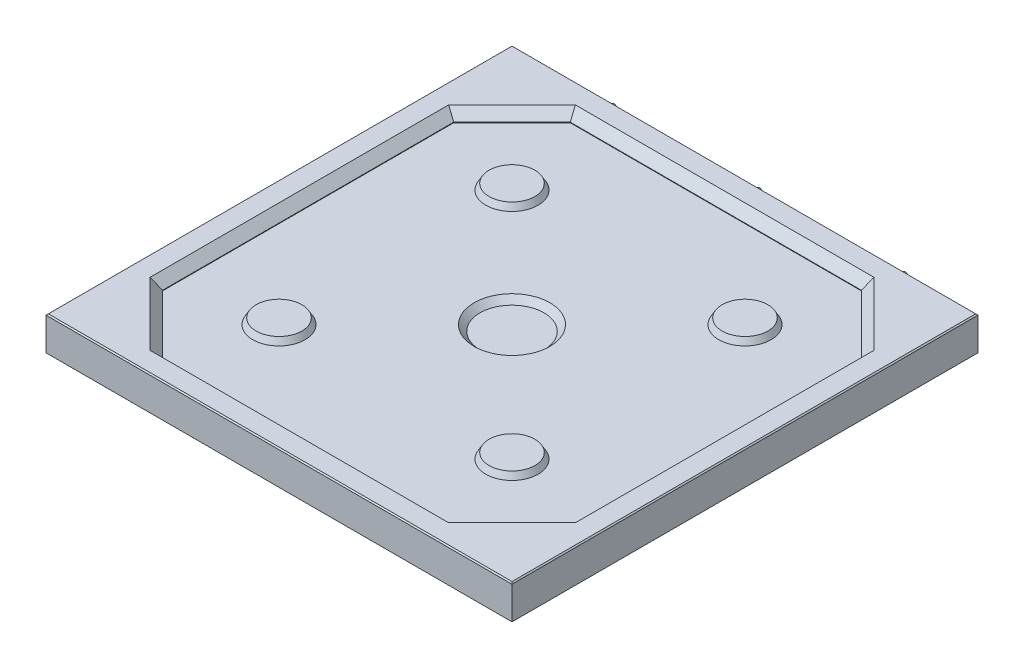
ISO-10303-21;
HEADER;
FILE_DESCRIPTION(('STEP AP214'),'2;1');
FILE_NAME('part.step','',(''),(''),'','','');
FILE_SCHEMA(('AUTOMOTIVE_DESIGN { 1 0 10303 214 1 1 1 1 }'));
ENDSEC;
DATA;
#1=APPLICATION_CONTEXT('core data for automotive mechanical design processes');
#2=APPLICATION_PROTOCOL_DEFINITION('international standard','automotive_design',2000,#1);
#3=PRODUCT_CONTEXT('',#1,'mechanical');
#4=PRODUCT('Part','Part','',(#3));
#5=PRODUCT_RELATED_PRODUCT_CATEGORY('part','',(#4));
#6=PRODUCT_DEFINITION_FORMATION('','',#4);
#7=PRODUCT_DEFINITION_CONTEXT('part definition',#1,'design');
#8=PRODUCT_DEFINITION('design','',#6,#7);
#9=PRODUCT_DEFINITION_SHAPE('','',#8);
#10=(LENGTH_UNIT() NAMED_UNIT(*) SI_UNIT(.MILLI.,.METRE.));
#11=(NAMED_UNIT(*) PLANE_ANGLE_UNIT() SI_UNIT($,.RADIAN.));
#12=(NAMED_UNIT(*) SI_UNIT($,.STERADIAN.) SOLID_ANGLE_UNIT());
#13=UNCERTAINTY_MEASURE_WITH_UNIT(LENGTH_MEASURE(1.E-05),#10,'distance_accuracy_value','');
#14=(GEOMETRIC_REPRESENTATION_CONTEXT(3) GLOBAL_UNCERTAINTY_ASSIGNED_CONTEXT((#13)) GLOBAL_UNIT_ASSIGNED_CONTEXT((#10,
#11,#12)) REPRESENTATION_CONTEXT('',''));
#15=CARTESIAN_POINT('',(0.,0.,0.));
#16=DIRECTION('',(0.,0.,1.));
#17=DIRECTION('',(1.,0.,0.));
#18=AXIS2_PLACEMENT_3D('',#15,#16,#17);
#19=CARTESIAN_POINT('',(0.,34.,0.));
#20=DIRECTION('',(0.,1.,0.));
#21=DIRECTION('',(0.,0.,1.));
#22=AXIS2_PLACEMENT_3D('',#19,#20,#21);
#23=PLANE('',#22);
#24=CARTESIAN_POINT('',(0.,33.9999999999998,0.));
#25=DIRECTION('',(0.,1.,0.));
#26=DIRECTION('',(0.,0.,1.));
#27=AXIS2_PLACEMENT_3D('',#24,#25,#26);
#28=CIRCLE('',#27,55.0000000000002);
#29=CARTESIAN_POINT('',(0.,33.9999999999998,55.0000000000002));
#30=VERTEX_POINT('',#29);
#31=EDGE_CURVE('E20',#30,#30,#28,.T.);
#32=ORIENTED_EDGE('',*,*,#31,.T.);
#33=EDGE_LOOP('',(#32));
#34=FACE_BOUND('',#33,.T.);
#35=ADVANCED_FACE('F17',(#34),#23,.T.);
#36=CARTESIAN_POINT('',(-200.,54.,200.));
#37=DIRECTION('',(0.,1.,0.));
#38=DIRECTION('',(0.,0.,1.));
#39=AXIS2_PLACEMENT_3D('',#36,#37,#38);
#40=PLANE('',#39);
#41=CARTESIAN_POINT('',(-200.,54.,200.));
#42=DIRECTION('',(0.,-1.,0.));
#43=DIRECTION('',(0.,0.,-1.));
#44=AXIS2_PLACEMENT_3D('',#41,#42,#43);
#45=CIRCLE('',#44,39.2264973081037);
#46=CARTESIAN_POINT('',(-200.,54.,160.773502691896));
#47=VERTEX_POINT('',#46);
#48=EDGE_CURVE('E230',#47,#47,#45,.T.);
#49=ORIENTED_EDGE('',*,*,#48,.F.);
#50=EDGE_LOOP('',(#49));
#51=FACE_BOUND('',#50,.T.);
#52=ADVANCED_FACE('F423',(#51),#40,.T.);
#53=CARTESIAN_POINT('',(200.,54.,200.));
#54=DIRECTION('',(0.,1.,0.));
#55=DIRECTION('',(0.,0.,1.));
#56=AXIS2_PLACEMENT_3D('',#53,#54,#55);
#57=PLANE('',#56);
#58=CARTESIAN_POINT('',(200.,54.,200.));
#59=DIRECTION('',(0.,-1.,0.));
#60=DIRECTION('',(0.,0.,-1.));
#61=AXIS2_PLACEMENT_3D('',#58,#59,#60);
#62=CIRCLE('',#61,39.2264973081037);
#63=CARTESIAN_POINT('',(200.,54.,160.773502691896));
#64=VERTEX_POINT('',#63);
#65=EDGE_CURVE('E228',#64,#64,#62,.T.);
#66=ORIENTED_EDGE('',*,*,#65,.F.);
#67=EDGE_LOOP('',(#66));
#68=FACE_BOUND('',#67,.T.);
#69=ADVANCED_FACE('F421',(#68),#57,.T.);
#70=CARTESIAN_POINT('',(200.,54.,-200.));
#71=DIRECTION('',(0.,1.,0.));
#72=DIRECTION('',(0.,0.,1.));
#73=AXIS2_PLACEMENT_3D('',#70,#71,#72);
#74=PLANE('',#73);
#75=CARTESIAN_POINT('',(200.,54.,-200.));
#76=DIRECTION('',(0.,-1.,0.));
#77=DIRECTION('',(0.,0.,-1.));
#78=AXIS2_PLACEMENT_3D('',#75,#76,#77);
#79=CIRCLE('',#78,39.2264973081037);
#80=CARTESIAN_POINT('',(200.,54.,-239.226497308104));
#81=VERTEX_POINT('',#80);
#82=EDGE_CURVE('E225',#81,#81,#79,.T.);
#83=ORIENTED_EDGE('',*,*,#82,.F.);
#84=EDGE_LOOP('',(#83));
#85=FACE_BOUND('',#84,.T.);
#86=ADVANCED_FACE('F251',(#85),#74,.T.);
#87=CARTESIAN_POINT('',(-200.,54.,-200.));
#88=DIRECTION('',(0.,1.,0.));
#89=DIRECTION('',(0.,0.,1.));
#90=AXIS2_PLACEMENT_3D('',#87,#88,#89);
#91=PLANE('',#90);
#92=CARTESIAN_POINT('',(-200.,54.,-200.));
#93=DIRECTION('',(0.,-1.,0.));
#94=DIRECTION('',(0.,0.,-1.));
#95=AXIS2_PLACEMENT_3D('',#92,#93,#94);
#96=CIRCLE('',#95,39.2264973081037);
#97=CARTESIAN_POINT('',(-200.,54.,-239.226497308104));
#98=VERTEX_POINT('',#97);
#99=EDGE_CURVE('E222',#98,#98,#96,.T.);
#100=ORIENTED_EDGE('',*,*,#99,.F.);
#101=EDGE_LOOP('',(#100));
#102=FACE_BOUND('',#101,.T.);
#103=ADVANCED_FACE('F241',(#102),#91,.T.);
#104=CARTESIAN_POINT('',(0.,44.,0.));
#105=DIRECTION('',(0.,1.,0.));
#106=DIRECTION('',(0.,0.,1.));
#107=AXIS2_PLACEMENT_3D('',#104,#105,#106);
#108=CONICAL_SURFACE('',#107,65.0000000000004,0.78539816339745);
#109=CARTESIAN_POINT('',(0.,44.,0.));
#110=DIRECTION('',(0.,1.,0.));
#111=DIRECTION('',(0.,0.,1.));
#112=AXIS2_PLACEMENT_3D('',#109,#110,#111);
#113=CIRCLE('',#112,65.0000000000004);
#114=CARTESIAN_POINT('',(0.,44.,65.0000000000004));
#115=VERTEX_POINT('',#114);
#116=EDGE_CURVE('E219',#115,#115,#113,.T.);
#117=ORIENTED_EDGE('',*,*,#116,.T.);
#118=EDGE_LOOP('',(#117));
#119=FACE_BOUND('',#118,.T.);
#120=ORIENTED_EDGE('',*,*,#31,.F.);
#121=EDGE_LOOP('',(#120));
#122=FACE_BOUND('',#121,.T.);
#123=ADVANCED_FACE('F238',(#119,#122),#108,.F.);
#124=CARTESIAN_POINT('',(-200.,44.,200.));
#125=DIRECTION('',(0.,-1.,0.));
#126=DIRECTION('',(0.,0.,-1.));
#127=AXIS2_PLACEMENT_3D('',#124,#125,#126);
#128=CONICAL_SURFACE('',#127,45.,0.523598775598298);
#129=ORIENTED_EDGE('',*,*,#48,.T.);
#130=EDGE_LOOP('',(#129));
#131=FACE_BOUND('',#130,.T.);
#132=CARTESIAN_POINT('',(-200.,44.,200.));
#133=DIRECTION('',(0.,-1.,0.));
#134=DIRECTION('',(0.,0.,-1.));
#135=AXIS2_PLACEMENT_3D('',#132,#133,#134);
#136=CIRCLE('',#135,45.);
#137=CARTESIAN_POINT('',(-200.,44.,155.));
#138=VERTEX_POINT('',#137);
#139=EDGE_CURVE('E216',#138,#138,#136,.F.);
#140=ORIENTED_EDGE('',*,*,#139,.T.);
#141=EDGE_LOOP('',(#140));
#142=FACE_BOUND('',#141,.T.);
#143=ADVANCED_FACE('F240',(#131,#142),#128,.T.);
#144=CARTESIAN_POINT('',(200.,44.,200.));
#145=DIRECTION('',(0.,-1.,0.));
#146=DIRECTION('',(0.,0.,-1.));
#147=AXIS2_PLACEMENT_3D('',#144,#145,#146);
#148=CONICAL_SURFACE('',#147,45.,0.5235987755983);
#149=ORIENTED_EDGE('',*,*,#65,.T.);
#150=EDGE_LOOP('',(#149));
#151=FACE_BOUND('',#150,.T.);
#152=CARTESIAN_POINT('',(200.,44.,200.));
#153=DIRECTION('',(0.,-1.,0.));
#154=DIRECTION('',(0.,0.,-1.));
#155=AXIS2_PLACEMENT_3D('',#152,#153,#154);
#156=CIRCLE('',#155,45.);
#157=CARTESIAN_POINT('',(200.,44.,155.));
#158=VERTEX_POINT('',#157);
#159=EDGE_CURVE('E213',#158,#158,#156,.F.);
#160=ORIENTED_EDGE('',*,*,#159,.T.);
#161=EDGE_LOOP('',(#160));
#162=FACE_BOUND('',#161,.T.);
#163=ADVANCED_FACE('F249',(#151,#162),#148,.T.);
#164=CARTESIAN_POINT('',(200.,44.,-200.));
#165=DIRECTION('',(0.,-1.,0.));
#166=DIRECTION('',(0.,0.,-1.));
#167=AXIS2_PLACEMENT_3D('',#164,#165,#166);
#168=CONICAL_SURFACE('',#167,45.,0.5235987755983);
#169=ORIENTED_EDGE('',*,*,#82,.T.);
#170=EDGE_LOOP('',(#169));
#171=FACE_BOUND('',#170,.T.);
#172=CARTESIAN_POINT('',(200.,44.,-200.));
#173=DIRECTION('',(0.,-1.,0.));
#174=DIRECTION('',(0.,0.,-1.));
#175=AXIS2_PLACEMENT_3D('',#172,#173,#174);
#176=CIRCLE('',#175,45.);
#177=CARTESIAN_POINT('',(200.,44.,-245.));
#178=VERTEX_POINT('',#177);
#179=EDGE_CURVE('E210',#178,#178,#176,.F.);
#180=ORIENTED_EDGE('',*,*,#179,.T.);
#181=EDGE_LOOP('',(#180));
#182=FACE_BOUND('',#181,.T.);
#183=ADVANCED_FACE('F402',(#171,#182),#168,.T.);
#184=CARTESIAN_POINT('',(-200.,44.,-200.));
#185=DIRECTION('',(0.,-1.,0.));
#186=DIRECTION('',(0.,0.,-1.));
#187=AXIS2_PLACEMENT_3D('',#184,#185,#186);
#188=CONICAL_SURFACE('',#187,45.,0.523598775598298);
#189=ORIENTED_EDGE('',*,*,#99,.T.);
#190=EDGE_LOOP('',(#189));
#191=FACE_BOUND('',#190,.T.);
#192=CARTESIAN_POINT('',(-200.,44.,-200.));
#193=DIRECTION('',(0.,-1.,0.));
#194=DIRECTION('',(0.,0.,-1.));
#195=AXIS2_PLACEMENT_3D('',#192,#193,#194);
#196=CIRCLE('',#195,45.);
#197=CARTESIAN_POINT('',(-200.,44.,-245.));
#198=VERTEX_POINT('',#197);
#199=EDGE_CURVE('E163',#198,#198,#196,.F.);
#200=ORIENTED_EDGE('',*,*,#199,.T.);
#201=EDGE_LOOP('',(#200));
#202=FACE_BOUND('',#201,.T.);
#203=ADVANCED_FACE('F399',(#191,#202),#188,.T.);
#204=CARTESIAN_POINT('',(-2.4980018054066E-13,44.,-600.));
#205=DIRECTION('',(0.,-1.,0.));
#206=DIRECTION('',(0.,0.,-1.));
#207=AXIS2_PLACEMENT_3D('',#204,#205,#206);
#208=PLANE('',#207);
#209=DIRECTION('',(0.,0.,1.));
#210=VECTOR('',#209,1.);
#211=CARTESIAN_POINT('',(-350.,44.,-250.));
#212=LINE('',#211,#210);
#213=CARTESIAN_POINT('',(-350.,44.,-250.));
#214=VERTEX_POINT('',#213);
#215=CARTESIAN_POINT('',(-350.,44.,250.));
#216=VERTEX_POINT('',#215);
#217=EDGE_CURVE('E675',#214,#216,#212,.T.);
#218=ORIENTED_EDGE('',*,*,#217,.T.);
#219=DIRECTION('',(0.707106781186548,0.,0.707106781186548));
#220=VECTOR('',#219,1.);
#221=CARTESIAN_POINT('',(-350.,44.,250.));
#222=LINE('',#221,#220);
#223=CARTESIAN_POINT('',(-250.,44.,350.));
#224=VERTEX_POINT('',#223);
#225=EDGE_CURVE('E676',#216,#224,#222,.T.);
#226=ORIENTED_EDGE('',*,*,#225,.T.);
#227=DIRECTION('',(1.,0.,0.));
#228=VECTOR('',#227,1.);
#229=CARTESIAN_POINT('',(-250.,44.,350.));
#230=LINE('',#229,#228);
#231=CARTESIAN_POINT('',(250.,44.,350.));
#232=VERTEX_POINT('',#231);
#233=EDGE_CURVE('E711',#224,#232,#230,.T.);
#234=ORIENTED_EDGE('',*,*,#233,.T.);
#235=DIRECTION('',(0.707106781186547,0.,-0.707106781186548));
#236=VECTOR('',#235,1.);
#237=CARTESIAN_POINT('',(250.,44.,350.));
#238=LINE('',#237,#236);
#239=CARTESIAN_POINT('',(350.,44.,250.));
#240=VERTEX_POINT('',#239);
#241=EDGE_CURVE('E706',#232,#240,#238,.T.);
#242=ORIENTED_EDGE('',*,*,#241,.T.);
#243=DIRECTION('',(0.,0.,-1.));
#244=VECTOR('',#243,1.);
#245=CARTESIAN_POINT('',(350.,44.,-250.));
#246=LINE('',#245,#244);
#247=CARTESIAN_POINT('',(350.,44.,-250.));
#248=VERTEX_POINT('',#247);
#249=EDGE_CURVE('E160',#240,#248,#246,.T.);
#250=ORIENTED_EDGE('',*,*,#249,.T.);
#251=DIRECTION('',(-0.707106781186548,0.,-0.707106781186547));
#252=VECTOR('',#251,1.);
#253=CARTESIAN_POINT('',(250.,44.,-350.));
#254=LINE('',#253,#252);
#255=CARTESIAN_POINT('',(250.,44.,-350.));
#256=VERTEX_POINT('',#255);
#257=EDGE_CURVE('E155',#248,#256,#254,.T.);
#258=ORIENTED_EDGE('',*,*,#257,.T.);
#259=DIRECTION('',(-1.,0.,0.));
#260=VECTOR('',#259,1.);
#261=CARTESIAN_POINT('',(-250.,44.,-350.));
#262=LINE('',#261,#260);
#263=CARTESIAN_POINT('',(-250.,44.,-350.));
#264=VERTEX_POINT('',#263);
#265=EDGE_CURVE('E152',#256,#264,#262,.T.);
#266=ORIENTED_EDGE('',*,*,#265,.T.);
#267=DIRECTION('',(-0.707106781186548,0.,0.707106781186548));
#268=VECTOR('',#267,1.);
#269=CARTESIAN_POINT('',(-350.,44.,-250.));
#270=LINE('',#269,#268);
#271=EDGE_CURVE('E173',#264,#214,#270,.T.);
#272=ORIENTED_EDGE('',*,*,#271,.T.);
#273=EDGE_LOOP('',(#218,#226,#234,#242,#250,#258,#266,#272));
#274=FACE_BOUND('',#273,.T.);
#275=ORIENTED_EDGE('',*,*,#199,.F.);
#276=EDGE_LOOP('',(#275));
#277=FACE_BOUND('',#276,.T.);
#278=ORIENTED_EDGE('',*,*,#179,.F.);
#279=EDGE_LOOP('',(#278));
#280=FACE_BOUND('',#279,.T.);
#281=ORIENTED_EDGE('',*,*,#159,.F.);
#282=EDGE_LOOP('',(#281));
#283=FACE_BOUND('',#282,.T.);
#284=ORIENTED_EDGE('',*,*,#139,.F.);
#285=EDGE_LOOP('',(#284));
#286=FACE_BOUND('',#285,.T.);
#287=ORIENTED_EDGE('',*,*,#116,.F.);
#288=EDGE_LOOP('',(#287));
#289=FACE_BOUND('',#288,.T.);
#290=ADVANCED_FACE('F157',(#274,#277,#280,#283,#286,#289),#208,.F.);
#291=CARTESIAN_POINT('',(250.,44.,-350.));
#292=DIRECTION('',(0.707106781186547,0.,-0.707106781186548));
#293=DIRECTION('',(-0.707106781186548,0.,-0.707106781186547));
#294=AXIS2_PLACEMENT_3D('',#291,#292,#293);
#295=PLANE('',#294);
#296=DIRECTION('',(-0.707106781186547,0.,-0.707106781186548));
#297=VECTOR('',#296,1.);
#298=CARTESIAN_POINT('',(350.,45.,-250.));
#299=LINE('',#298,#297);
#300=CARTESIAN_POINT('',(350.,45.,-250.));
#301=VERTEX_POINT('',#300);
#302=CARTESIAN_POINT('',(250.,45.,-350.));
#303=VERTEX_POINT('',#302);
#304=EDGE_CURVE('E169',#301,#303,#299,.T.);
#305=ORIENTED_EDGE('',*,*,#304,.T.);
#306=DIRECTION('',(0.,1.,0.));
#307=VECTOR('',#306,1.);
#308=CARTESIAN_POINT('',(250.,44.,-350.));
#309=LINE('',#308,#307);
#310=EDGE_CURVE('E166',#303,#256,#309,.F.);
#311=ORIENTED_EDGE('',*,*,#310,.T.);
#312=ORIENTED_EDGE('',*,*,#257,.F.);
#313=DIRECTION('',(0.,1.,0.));
#314=VECTOR('',#313,1.);
#315=CARTESIAN_POINT('',(350.,44.,-250.));
#316=LINE('',#315,#314);
#317=EDGE_CURVE('E700',#248,#301,#316,.T.);
#318=ORIENTED_EDGE('',*,*,#317,.T.);
#319=EDGE_LOOP('',(#305,#311,#312,#318));
#320=FACE_BOUND('',#319,.T.);
#321=ADVANCED_FACE('F167',(#320),#295,.F.);
#322=CARTESIAN_POINT('',(-250.,44.,-350.));
#323=DIRECTION('',(0.,0.,-1.));
#324=DIRECTION('',(-1.,0.,0.));
#325=AXIS2_PLACEMENT_3D('',#322,#323,#324);
#326=PLANE('',#325);
#327=DIRECTION('',(1.,0.,0.));
#328=VECTOR('',#327,1.);
#329=CARTESIAN_POINT('',(-250.,45.,-350.));
#330=LINE('',#329,#328);
#331=CARTESIAN_POINT('',(-250.,45.,-350.));
#332=VERTEX_POINT('',#331);
#333=EDGE_CURVE('E669',#303,#332,#330,.F.);
#334=ORIENTED_EDGE('',*,*,#333,.T.);
#335=DIRECTION('',(0.,1.,0.));
#336=VECTOR('',#335,1.);
#337=CARTESIAN_POINT('',(-250.,44.,-350.));
#338=LINE('',#337,#336);
#339=EDGE_CURVE('E177',#332,#264,#338,.F.);
#340=ORIENTED_EDGE('',*,*,#339,.T.);
#341=ORIENTED_EDGE('',*,*,#265,.F.);
#342=ORIENTED_EDGE('',*,*,#310,.F.);
#343=EDGE_LOOP('',(#334,#340,#341,#342));
#344=FACE_BOUND('',#343,.T.);
#345=ADVANCED_FACE('F175',(#344),#326,.F.);
#346=CARTESIAN_POINT('',(-350.,44.,-250.));
#347=DIRECTION('',(-0.707106781186548,0.,-0.707106781186548));
#348=DIRECTION('',(-0.707106781186548,0.,0.707106781186548));
#349=AXIS2_PLACEMENT_3D('',#346,#347,#348);
#350=PLANE('',#349);
#351=DIRECTION('',(-0.707106781186548,0.,0.707106781186547));
#352=VECTOR('',#351,1.);
#353=CARTESIAN_POINT('',(-250.,45.,-350.));
#354=LINE('',#353,#352);
#355=CARTESIAN_POINT('',(-350.,45.,-250.));
#356=VERTEX_POINT('',#355);
#357=EDGE_CURVE('E661',#332,#356,#354,.T.);
#358=ORIENTED_EDGE('',*,*,#357,.T.);
#359=DIRECTION('',(0.,1.,0.));
#360=VECTOR('',#359,1.);
#361=CARTESIAN_POINT('',(-350.,44.,-250.));
#362=LINE('',#361,#360);
#363=EDGE_CURVE('E663',#356,#214,#362,.F.);
#364=ORIENTED_EDGE('',*,*,#363,.T.);
#365=ORIENTED_EDGE('',*,*,#271,.F.);
#366=ORIENTED_EDGE('',*,*,#339,.F.);
#367=EDGE_LOOP('',(#358,#364,#365,#366));
#368=FACE_BOUND('',#367,.T.);
#369=ADVANCED_FACE('F388',(#368),#350,.F.);
#370=CARTESIAN_POINT('',(-350.,44.,-250.));
#371=DIRECTION('',(-1.,0.,0.));
#372=DIRECTION('',(0.,0.,1.));
#373=AXIS2_PLACEMENT_3D('',#370,#371,#372);
#374=PLANE('',#373);
#375=DIRECTION('',(0.,0.,1.));
#376=VECTOR('',#375,1.);
#377=CARTESIAN_POINT('',(-350.,45.,-250.));
#378=LINE('',#377,#376);
#379=CARTESIAN_POINT('',(-350.,45.,250.));
#380=VERTEX_POINT('',#379);
#381=EDGE_CURVE('E673',#356,#380,#378,.T.);
#382=ORIENTED_EDGE('',*,*,#381,.T.);
#383=DIRECTION('',(0.,1.,0.));
#384=VECTOR('',#383,1.);
#385=CARTESIAN_POINT('',(-350.,44.,250.));
#386=LINE('',#385,#384);
#387=EDGE_CURVE('E713',#380,#216,#386,.F.);
#388=ORIENTED_EDGE('',*,*,#387,.T.);
#389=ORIENTED_EDGE('',*,*,#217,.F.);
#390=ORIENTED_EDGE('',*,*,#363,.F.);
#391=EDGE_LOOP('',(#382,#388,#389,#390));
#392=FACE_BOUND('',#391,.T.);
#393=ADVANCED_FACE('F384',(#392),#374,.F.);
#394=CARTESIAN_POINT('',(-350.,44.,250.));
#395=DIRECTION('',(-0.707106781186548,0.,0.707106781186548));
#396=DIRECTION('',(0.707106781186548,0.,0.707106781186548));
#397=AXIS2_PLACEMENT_3D('',#394,#395,#396);
#398=PLANE('',#397);
#399=DIRECTION('',(0.707106781186547,0.,0.707106781186547));
#400=VECTOR('',#399,1.);
#401=CARTESIAN_POINT('',(-350.,45.,250.));
#402=LINE('',#401,#400);
#403=CARTESIAN_POINT('',(-250.,45.,350.));
#404=VERTEX_POINT('',#403);
#405=EDGE_CURVE('E683',#380,#404,#402,.T.);
#406=ORIENTED_EDGE('',*,*,#405,.T.);
#407=DIRECTION('',(0.,1.,0.));
#408=VECTOR('',#407,1.);
#409=CARTESIAN_POINT('',(-250.,44.,350.));
#410=LINE('',#409,#408);
#411=EDGE_CURVE('E708',#404,#224,#410,.F.);
#412=ORIENTED_EDGE('',*,*,#411,.T.);
#413=ORIENTED_EDGE('',*,*,#225,.F.);
#414=ORIENTED_EDGE('',*,*,#387,.F.);
#415=EDGE_LOOP('',(#406,#412,#413,#414));
#416=FACE_BOUND('',#415,.T.);
#417=ADVANCED_FACE('F380',(#416),#398,.F.);
#418=CARTESIAN_POINT('',(-250.,44.,350.));
#419=DIRECTION('',(0.,0.,1.));
#420=DIRECTION('',(1.,0.,0.));
#421=AXIS2_PLACEMENT_3D('',#418,#419,#420);
#422=PLANE('',#421);
#423=DIRECTION('',(1.,0.,0.));
#424=VECTOR('',#423,1.);
#425=CARTESIAN_POINT('',(-250.,45.,350.));
#426=LINE('',#425,#424);
#427=CARTESIAN_POINT('',(250.,45.,350.));
#428=VERTEX_POINT('',#427);
#429=EDGE_CURVE('E753',#404,#428,#426,.T.);
#430=ORIENTED_EDGE('',*,*,#429,.T.);
#431=DIRECTION('',(0.,1.,0.));
#432=VECTOR('',#431,1.);
#433=CARTESIAN_POINT('',(250.,44.,350.));
#434=LINE('',#433,#432);
#435=EDGE_CURVE('E703',#428,#232,#434,.F.);
#436=ORIENTED_EDGE('',*,*,#435,.T.);
#437=ORIENTED_EDGE('',*,*,#233,.F.);
#438=ORIENTED_EDGE('',*,*,#411,.F.);
#439=EDGE_LOOP('',(#430,#436,#437,#438));
#440=FACE_BOUND('',#439,.T.);
#441=ADVANCED_FACE('F376',(#440),#422,.F.);
#442=CARTESIAN_POINT('',(250.,44.,350.));
#443=DIRECTION('',(0.707106781186548,0.,0.707106781186547));
#444=DIRECTION('',(0.707106781186547,0.,-0.707106781186548));
#445=AXIS2_PLACEMENT_3D('',#442,#443,#444);
#446=PLANE('',#445);
#447=DIRECTION('',(0.707106781186547,0.,-0.707106781186548));
#448=VECTOR('',#447,1.);
#449=CARTESIAN_POINT('',(250.,45.,350.));
#450=LINE('',#449,#448);
#451=CARTESIAN_POINT('',(350.,45.,250.));
#452=VERTEX_POINT('',#451);
#453=EDGE_CURVE('E725',#428,#452,#450,.T.);
#454=ORIENTED_EDGE('',*,*,#453,.T.);
#455=DIRECTION('',(0.,1.,0.));
#456=VECTOR('',#455,1.);
#457=CARTESIAN_POINT('',(350.,44.,250.));
#458=LINE('',#457,#456);
#459=EDGE_CURVE('E697',#452,#240,#458,.F.);
#460=ORIENTED_EDGE('',*,*,#459,.T.);
#461=ORIENTED_EDGE('',*,*,#241,.F.);
#462=ORIENTED_EDGE('',*,*,#435,.F.);
#463=EDGE_LOOP('',(#454,#460,#461,#462));
#464=FACE_BOUND('',#463,.T.);
#465=ADVANCED_FACE('F372',(#464),#446,.F.);
#466=CARTESIAN_POINT('',(350.,44.,-250.));
#467=DIRECTION('',(1.,0.,0.));
#468=DIRECTION('',(0.,0.,-1.));
#469=AXIS2_PLACEMENT_3D('',#466,#467,#468);
#470=PLANE('',#469);
#471=DIRECTION('',(0.,0.,1.));
#472=VECTOR('',#471,1.);
#473=CARTESIAN_POINT('',(350.,45.,-250.));
#474=LINE('',#473,#472);
#475=EDGE_CURVE('E729',#452,#301,#474,.F.);
#476=ORIENTED_EDGE('',*,*,#475,.T.);
#477=ORIENTED_EDGE('',*,*,#317,.F.);
#478=ORIENTED_EDGE('',*,*,#249,.F.);
#479=ORIENTED_EDGE('',*,*,#459,.F.);
#480=EDGE_LOOP('',(#476,#477,#478,#479));
#481=FACE_BOUND('',#480,.T.);
#482=ADVANCED_FACE('F368',(#481),#470,.F.);
#483=CARTESIAN_POINT('',(250.,45.,-350.));
#484=DIRECTION('',(0.499999999999998,-0.707106781186551,-0.499999999999998));
#485=DIRECTION('',(0.,0.577350269189622,-0.816496580927728));
#486=AXIS2_PLACEMENT_3D('',#483,#484,#485);
#487=PLANE('',#486);
#488=ORIENTED_EDGE('',*,*,#304,.F.);
#489=DIRECTION('',(0.678598344545849,0.678598344545844,-0.281084637714822));
#490=VECTOR('',#489,1.);
#491=CARTESIAN_POINT('',(350.,45.,-250.));
#492=LINE('',#491,#490);
#493=CARTESIAN_POINT('',(365.,60.,-256.213203435596));
#494=VERTEX_POINT('',#493);
#495=EDGE_CURVE('E732',#301,#494,#492,.T.);
#496=ORIENTED_EDGE('',*,*,#495,.T.);
#497=DIRECTION('',(-0.707106781186547,0.,-0.707106781186548));
#498=VECTOR('',#497,1.);
#499=CARTESIAN_POINT('',(365.,60.,-256.213203435596));
#500=LINE('',#499,#498);
#501=CARTESIAN_POINT('',(256.213203435596,60.,-365.));
#502=VERTEX_POINT('',#501);
#503=EDGE_CURVE('E740',#494,#502,#500,.T.);
#504=ORIENTED_EDGE('',*,*,#503,.T.);
#505=DIRECTION('',(-0.281084637714822,-0.678598344545844,0.678598344545849));
#506=VECTOR('',#505,1.);
#507=CARTESIAN_POINT('',(256.213203435596,60.,-365.));
#508=LINE('',#507,#506);
#509=EDGE_CURVE('E694',#502,#303,#508,.T.);
#510=ORIENTED_EDGE('',*,*,#509,.T.);
#511=EDGE_LOOP('',(#488,#496,#504,#510));
#512=FACE_BOUND('',#511,.T.);
#513=ADVANCED_FACE('F364',(#512),#487,.F.);
#514=CARTESIAN_POINT('',(-250.,45.,-350.));
#515=DIRECTION('',(0.,-0.70710678118655,-0.707106781186545));
#516=DIRECTION('',(0.,0.707106781186545,-0.70710678118655));
#517=AXIS2_PLACEMENT_3D('',#514,#515,#516);
#518=PLANE('',#517);
#519=ORIENTED_EDGE('',*,*,#333,.F.);
#520=ORIENTED_EDGE('',*,*,#509,.F.);
#521=DIRECTION('',(1.,0.,0.));
#522=VECTOR('',#521,1.);
#523=CARTESIAN_POINT('',(-400.,60.,-365.));
#524=LINE('',#523,#522);
#525=CARTESIAN_POINT('',(-256.213203435597,60.,-365.));
#526=VERTEX_POINT('',#525);
#527=EDGE_CURVE('E742',#502,#526,#524,.F.);
#528=ORIENTED_EDGE('',*,*,#527,.T.);
#529=DIRECTION('',(0.281084637714827,-0.678598344545843,0.678598344545848));
#530=VECTOR('',#529,1.);
#531=CARTESIAN_POINT('',(-256.213203435597,60.,-365.));
#532=LINE('',#531,#530);
#533=EDGE_CURVE('E668',#526,#332,#532,.T.);
#534=ORIENTED_EDGE('',*,*,#533,.T.);
#535=EDGE_LOOP('',(#519,#520,#528,#534));
#536=FACE_BOUND('',#535,.T.);
#537=ADVANCED_FACE('F360',(#536),#518,.F.);
#538=CARTESIAN_POINT('',(-350.,45.,-250.));
#539=DIRECTION('',(-0.499999999999997,-0.707106781186552,-0.499999999999997));
#540=DIRECTION('',(0.,0.577350269189621,-0.816496580927729));
#541=AXIS2_PLACEMENT_3D('',#538,#539,#540);
#542=PLANE('',#541);
#543=DIRECTION('',(-0.707106781186548,0.,0.707106781186548));
#544=VECTOR('',#543,1.);
#545=CARTESIAN_POINT('',(-256.213203435597,60.,-365.));
#546=LINE('',#545,#544);
#547=CARTESIAN_POINT('',(-365.,60.,-256.213203435597));
#548=VERTEX_POINT('',#547);
#549=EDGE_CURVE('E681',#526,#548,#546,.T.);
#550=ORIENTED_EDGE('',*,*,#549,.T.);
#551=DIRECTION('',(0.678598344545847,-0.678598344545844,0.281084637714828));
#552=VECTOR('',#551,1.);
#553=CARTESIAN_POINT('',(-365.,60.,-256.213203435597));
#554=LINE('',#553,#552);
#555=EDGE_CURVE('E679',#548,#356,#554,.T.);
#556=ORIENTED_EDGE('',*,*,#555,.T.);
#557=ORIENTED_EDGE('',*,*,#357,.F.);
#558=ORIENTED_EDGE('',*,*,#533,.F.);
#559=EDGE_LOOP('',(#550,#556,#557,#558));
#560=FACE_BOUND('',#559,.T.);
#561=ADVANCED_FACE('F356',(#560),#542,.F.);
#562=CARTESIAN_POINT('',(-350.,45.,-250.));
#563=DIRECTION('',(-0.707106781186545,-0.70710678118655,0.));
#564=DIRECTION('',(0.70710678118655,-0.707106781186545,0.));
#565=AXIS2_PLACEMENT_3D('',#562,#563,#564);
#566=PLANE('',#565);
#567=DIRECTION('',(0.,0.,-1.));
#568=VECTOR('',#567,1.);
#569=CARTESIAN_POINT('',(-365.,60.,-400.));
#570=LINE('',#569,#568);
#571=CARTESIAN_POINT('',(-365.,60.,256.213203435596));
#572=VERTEX_POINT('',#571);
#573=EDGE_CURVE('E774',#548,#572,#570,.F.);
#574=ORIENTED_EDGE('',*,*,#573,.T.);
#575=DIRECTION('',(0.678598344545848,-0.678598344545845,-0.281084637714823));
#576=VECTOR('',#575,1.);
#577=CARTESIAN_POINT('',(-365.,60.,256.213203435596));
#578=LINE('',#577,#576);
#579=EDGE_CURVE('E687',#572,#380,#578,.T.);
#580=ORIENTED_EDGE('',*,*,#579,.T.);
#581=ORIENTED_EDGE('',*,*,#381,.F.);
#582=ORIENTED_EDGE('',*,*,#555,.F.);
#583=EDGE_LOOP('',(#574,#580,#581,#582));
#584=FACE_BOUND('',#583,.T.);
#585=ADVANCED_FACE('F352',(#584),#566,.F.);
#586=CARTESIAN_POINT('',(-350.,45.,250.));
#587=DIRECTION('',(-0.499999999999998,-0.707106781186551,0.499999999999998));
#588=DIRECTION('',(0.,-0.577350269189622,-0.816496580927728));
#589=AXIS2_PLACEMENT_3D('',#586,#587,#588);
#590=PLANE('',#589);
#591=DIRECTION('',(0.707106781186547,0.,0.707106781186547));
#592=VECTOR('',#591,1.);
#593=CARTESIAN_POINT('',(-365.,60.,256.213203435596));
#594=LINE('',#593,#592);
#595=CARTESIAN_POINT('',(-256.213203435597,60.,365.));
#596=VERTEX_POINT('',#595);
#597=EDGE_CURVE('E772',#572,#596,#594,.T.);
#598=ORIENTED_EDGE('',*,*,#597,.T.);
#599=DIRECTION('',(0.281084637714825,-0.678598344545844,-0.678598344545848));
#600=VECTOR('',#599,1.);
#601=CARTESIAN_POINT('',(-256.213203435597,60.,365.));
#602=LINE('',#601,#600);
#603=EDGE_CURVE('E751',#596,#404,#602,.T.);
#604=ORIENTED_EDGE('',*,*,#603,.T.);
#605=ORIENTED_EDGE('',*,*,#405,.F.);
#606=ORIENTED_EDGE('',*,*,#579,.F.);
#607=EDGE_LOOP('',(#598,#604,#605,#606));
#608=FACE_BOUND('',#607,.T.);
#609=ADVANCED_FACE('F348',(#608),#590,.F.);
#610=CARTESIAN_POINT('',(-250.,45.,350.));
#611=DIRECTION('',(0.,-0.707106781186549,0.707106781186546));
#612=DIRECTION('',(0.,-0.707106781186546,-0.707106781186549));
#613=AXIS2_PLACEMENT_3D('',#610,#611,#612);
#614=PLANE('',#613);
#615=DIRECTION('',(1.,0.,0.));
#616=VECTOR('',#615,1.);
#617=CARTESIAN_POINT('',(-400.,60.,365.));
#618=LINE('',#617,#616);
#619=CARTESIAN_POINT('',(256.213203435597,60.,365.));
#620=VERTEX_POINT('',#619);
#621=EDGE_CURVE('E759',#596,#620,#618,.T.);
#622=ORIENTED_EDGE('',*,*,#621,.T.);
#623=DIRECTION('',(-0.281084637714836,-0.678598344545843,-0.678598344545844));
#624=VECTOR('',#623,1.);
#625=CARTESIAN_POINT('',(256.213203435597,60.,365.));
#626=LINE('',#625,#624);
#627=EDGE_CURVE('E747',#620,#428,#626,.T.);
#628=ORIENTED_EDGE('',*,*,#627,.T.);
#629=ORIENTED_EDGE('',*,*,#429,.F.);
#630=ORIENTED_EDGE('',*,*,#603,.F.);
#631=EDGE_LOOP('',(#622,#628,#629,#630));
#632=FACE_BOUND('',#631,.T.);
#633=ADVANCED_FACE('F344',(#632),#614,.F.);
#634=CARTESIAN_POINT('',(250.,45.,350.));
#635=DIRECTION('',(0.499999999999995,-0.707106781186555,0.499999999999995));
#636=DIRECTION('',(0.816496580927731,0.577350269189618,0.));
#637=AXIS2_PLACEMENT_3D('',#634,#635,#636);
#638=PLANE('',#637);
#639=DIRECTION('',(0.707106781186547,0.,-0.707106781186548));
#640=VECTOR('',#639,1.);
#641=CARTESIAN_POINT('',(256.213203435597,60.,365.));
#642=LINE('',#641,#640);
#643=CARTESIAN_POINT('',(365.,60.,256.213203435597));
#644=VERTEX_POINT('',#643);
#645=EDGE_CURVE('E761',#620,#644,#642,.T.);
#646=ORIENTED_EDGE('',*,*,#645,.T.);
#647=DIRECTION('',(-0.678598344545847,-0.678598344545842,-0.281084637714832));
#648=VECTOR('',#647,1.);
#649=CARTESIAN_POINT('',(365.,60.,256.213203435597));
#650=LINE('',#649,#648);
#651=EDGE_CURVE('E733',#644,#452,#650,.T.);
#652=ORIENTED_EDGE('',*,*,#651,.T.);
#653=ORIENTED_EDGE('',*,*,#453,.F.);
#654=ORIENTED_EDGE('',*,*,#627,.F.);
#655=EDGE_LOOP('',(#646,#652,#653,#654));
#656=FACE_BOUND('',#655,.T.);
#657=ADVANCED_FACE('F340',(#656),#638,.F.);
#658=CARTESIAN_POINT('',(350.,45.,-250.));
#659=DIRECTION('',(0.707106781186545,-0.70710678118655,0.));
#660=DIRECTION('',(0.70710678118655,0.707106781186545,0.));
#661=AXIS2_PLACEMENT_3D('',#658,#659,#660);
#662=PLANE('',#661);
#663=ORIENTED_EDGE('',*,*,#475,.F.);
#664=ORIENTED_EDGE('',*,*,#651,.F.);
#665=DIRECTION('',(0.,0.,-1.));
#666=VECTOR('',#665,1.);
#667=CARTESIAN_POINT('',(365.,60.,-400.));
#668=LINE('',#667,#666);
#669=EDGE_CURVE('E738',#644,#494,#668,.T.);
#670=ORIENTED_EDGE('',*,*,#669,.T.);
#671=ORIENTED_EDGE('',*,*,#495,.F.);
#672=EDGE_LOOP('',(#663,#664,#670,#671));
#673=FACE_BOUND('',#672,.T.);
#674=ADVANCED_FACE('F336',(#673),#662,.F.);
#675=CARTESIAN_POINT('',(0.,30.,-425.));
#676=DIRECTION('',(0.,0.,-1.));
#677=DIRECTION('',(-1.,0.,0.));
#678=AXIS2_PLACEMENT_3D('',#675,#676,#677);
#679=PLANE('',#678);
#680=CARTESIAN_POINT('',(0.,30.,-425.));
#681=DIRECTION('',(0.,0.,1.));
#682=DIRECTION('',(1.,0.,0.));
#683=AXIS2_PLACEMENT_3D('',#680,#681,#682);
#684=CIRCLE('',#683,5.);
#685=CARTESIAN_POINT('',(5.,30.,-425.));
#686=VERTEX_POINT('',#685);
#687=EDGE_CURVE('E203',#686,#686,#684,.T.);
#688=ORIENTED_EDGE('',*,*,#687,.F.);
#689=EDGE_LOOP('',(#688));
#690=FACE_BOUND('',#689,.T.);
#691=ADVANCED_FACE('F332',(#690),#679,.T.);
#692=CARTESIAN_POINT('',(250.,30.,-425.));
#693=DIRECTION('',(0.,0.,-1.));
#694=DIRECTION('',(-1.,0.,0.));
#695=AXIS2_PLACEMENT_3D('',#692,#693,#694);
#696=PLANE('',#695);
#697=CARTESIAN_POINT('',(250.,30.,-425.));
#698=DIRECTION('',(0.,0.,1.));
#699=DIRECTION('',(1.,0.,0.));
#700=AXIS2_PLACEMENT_3D('',#697,#698,#699);
#701=CIRCLE('',#700,5.);
#702=CARTESIAN_POINT('',(255.,30.,-425.));
#703=VERTEX_POINT('',#702);
#704=EDGE_CURVE('E199',#703,#703,#701,.T.);
#705=ORIENTED_EDGE('',*,*,#704,.F.);
#706=EDGE_LOOP('',(#705));
#707=FACE_BOUND('',#706,.T.);
#708=ADVANCED_FACE('F328',(#707),#696,.T.);
#709=CARTESIAN_POINT('',(-250.,30.,-425.));
#710=DIRECTION('',(0.,0.,-1.));
#711=DIRECTION('',(-1.,0.,0.));
#712=AXIS2_PLACEMENT_3D('',#709,#710,#711);
#713=PLANE('',#712);
#714=CARTESIAN_POINT('',(-250.,30.,-425.));
#715=DIRECTION('',(0.,0.,1.));
#716=DIRECTION('',(1.,0.,0.));
#717=AXIS2_PLACEMENT_3D('',#714,#715,#716);
#718=CIRCLE('',#717,5.);
#719=CARTESIAN_POINT('',(-245.,30.,-425.));
#720=VERTEX_POINT('',#719);
#721=EDGE_CURVE('E195',#720,#720,#718,.T.);
#722=ORIENTED_EDGE('',*,*,#721,.F.);
#723=EDGE_LOOP('',(#722));
#724=FACE_BOUND('',#723,.T.);
#725=ADVANCED_FACE('F324',(#724),#713,.T.);
#726=CARTESIAN_POINT('',(-400.,60.,-400.));
#727=DIRECTION('',(0.,-1.,0.));
#728=DIRECTION('',(0.,0.,-1.));
#729=AXIS2_PLACEMENT_3D('',#726,#727,#728);
#730=PLANE('',#729);
#731=ORIENTED_EDGE('',*,*,#645,.F.);
#732=ORIENTED_EDGE('',*,*,#621,.F.);
#733=ORIENTED_EDGE('',*,*,#597,.F.);
#734=ORIENTED_EDGE('',*,*,#573,.F.);
#735=ORIENTED_EDGE('',*,*,#549,.F.);
#736=ORIENTED_EDGE('',*,*,#527,.F.);
#737=ORIENTED_EDGE('',*,*,#503,.F.);
#738=ORIENTED_EDGE('',*,*,#669,.F.);
#739=EDGE_LOOP('',(#731,#732,#733,#734,#735,#736,#737,#738));
#740=FACE_BOUND('',#739,.T.);
#741=DIRECTION('',(1.,0.,0.));
#742=VECTOR('',#741,1.);
#743=CARTESIAN_POINT('',(-400.,60.,-398.));
#744=LINE('',#743,#742);
#745=CARTESIAN_POINT('',(398.,60.,-398.));
#746=VERTEX_POINT('',#745);
#747=CARTESIAN_POINT('',(-398.,60.,-398.));
#748=VERTEX_POINT('',#747);
#749=EDGE_CURVE('E206',#746,#748,#744,.F.);
#750=ORIENTED_EDGE('',*,*,#749,.T.);
#751=DIRECTION('',(0.,0.,1.));
#752=VECTOR('',#751,1.);
#753=CARTESIAN_POINT('',(-398.,60.,-400.));
#754=LINE('',#753,#752);
#755=CARTESIAN_POINT('',(-398.,60.,398.));
#756=VERTEX_POINT('',#755);
#757=EDGE_CURVE('E766',#748,#756,#754,.T.);
#758=ORIENTED_EDGE('',*,*,#757,.T.);
#759=DIRECTION('',(1.,0.,0.));
#760=VECTOR('',#759,1.);
#761=CARTESIAN_POINT('',(-400.,60.,398.));
#762=LINE('',#761,#760);
#763=CARTESIAN_POINT('',(398.,60.,398.));
#764=VERTEX_POINT('',#763);
#765=EDGE_CURVE('E764',#756,#764,#762,.T.);
#766=ORIENTED_EDGE('',*,*,#765,.T.);
#767=DIRECTION('',(0.,0.,1.));
#768=VECTOR('',#767,1.);
#769=CARTESIAN_POINT('',(398.,60.,-400.));
#770=LINE('',#769,#768);
#771=EDGE_CURVE('E198',#764,#746,#770,.F.);
#772=ORIENTED_EDGE('',*,*,#771,.T.);
#773=EDGE_LOOP('',(#750,#758,#766,#772));
#774=FACE_BOUND('',#773,.T.);
#775=ADVANCED_FACE('F320',(#740,#774),#730,.F.);
#776=CARTESIAN_POINT('',(-400.,60.,398.));
#777=DIRECTION('',(0.,-0.707106781186548,-0.707106781186548));
#778=DIRECTION('',(0.,0.707106781186548,-0.707106781186548));
#779=AXIS2_PLACEMENT_3D('',#776,#777,#778);
#780=PLANE('',#779);
#781=DIRECTION('',(-1.,0.,0.));
#782=VECTOR('',#781,1.);
#783=CARTESIAN_POINT('',(-400.,58.0000000000001,400.));
#784=LINE('',#783,#782);
#785=CARTESIAN_POINT('',(-400.,58.0000000000001,400.));
#786=VERTEX_POINT('',#785);
#787=CARTESIAN_POINT('',(400.000000000001,58.,400.));
#788=VERTEX_POINT('',#787);
#789=EDGE_CURVE('E787',#786,#788,#784,.F.);
#790=ORIENTED_EDGE('',*,*,#789,.T.);
#791=DIRECTION('',(-0.577350269189626,0.577350269189626,-0.577350269189626));
#792=VECTOR('',#791,1.);
#793=CARTESIAN_POINT('',(400.,58.0000000000001,400.));
#794=LINE('',#793,#792);
#795=EDGE_CURVE('E784',#788,#764,#794,.T.);
#796=ORIENTED_EDGE('',*,*,#795,.T.);
#797=ORIENTED_EDGE('',*,*,#765,.F.);
#798=DIRECTION('',(-0.577350269189626,-0.577350269189626,0.577350269189626));
#799=VECTOR('',#798,1.);
#800=CARTESIAN_POINT('',(-398.,60.,398.000000000001));
#801=LINE('',#800,#799);
#802=EDGE_CURVE('E207',#756,#786,#801,.T.);
#803=ORIENTED_EDGE('',*,*,#802,.T.);
#804=EDGE_LOOP('',(#790,#796,#797,#803));
#805=FACE_BOUND('',#804,.T.);
#806=ADVANCED_FACE('F316',(#805),#780,.F.);
#807=CARTESIAN_POINT('',(-398.,60.,-400.));
#808=DIRECTION('',(0.707106781186548,-0.707106781186548,0.));
#809=DIRECTION('',(0.707106781186548,0.707106781186548,0.));
#810=AXIS2_PLACEMENT_3D('',#807,#808,#809);
#811=PLANE('',#810);
#812=ORIENTED_EDGE('',*,*,#757,.F.);
#813=DIRECTION('',(-0.577350269189626,-0.577350269189626,-0.577350269189626));
#814=VECTOR('',#813,1.);
#815=CARTESIAN_POINT('',(-398.,60.,-398.));
#816=LINE('',#815,#814);
#817=CARTESIAN_POINT('',(-400.,58.0000000000001,-400.));
#818=VERTEX_POINT('',#817);
#819=EDGE_CURVE('E202',#748,#818,#816,.T.);
#820=ORIENTED_EDGE('',*,*,#819,.T.);
#821=DIRECTION('',(0.,0.,-1.));
#822=VECTOR('',#821,1.);
#823=CARTESIAN_POINT('',(-400.,58.0000000000001,400.));
#824=LINE('',#823,#822);
#825=EDGE_CURVE('E789',#818,#786,#824,.F.);
#826=ORIENTED_EDGE('',*,*,#825,.T.);
#827=ORIENTED_EDGE('',*,*,#802,.F.);
#828=EDGE_LOOP('',(#812,#820,#826,#827));
#829=FACE_BOUND('',#828,.T.);
#830=ADVANCED_FACE('F312',(#829),#811,.F.);
#831=CARTESIAN_POINT('',(0.,30.,-425.));
#832=DIRECTION('',(0.,0.,1.));
#833=DIRECTION('',(1.,0.,0.));
#834=AXIS2_PLACEMENT_3D('',#831,#832,#833);
#835=CYLINDRICAL_SURFACE('',#834,5.);
#836=ORIENTED_EDGE('',*,*,#687,.T.);
#837=EDGE_LOOP('',(#836));
#838=FACE_BOUND('',#837,.T.);
#839=CARTESIAN_POINT('',(0.,30.,-400.));
#840=DIRECTION('',(0.,0.,1.));
#841=DIRECTION('',(1.,0.,0.));
#842=AXIS2_PLACEMENT_3D('',#839,#840,#841);
#843=CIRCLE('',#842,5.);
#844=CARTESIAN_POINT('',(5.,30.,-400.));
#845=VERTEX_POINT('',#844);
#846=EDGE_CURVE('E190',#845,#845,#843,.F.);
#847=ORIENTED_EDGE('',*,*,#846,.T.);
#848=EDGE_LOOP('',(#847));
#849=FACE_BOUND('',#848,.T.);
#850=ADVANCED_FACE('F308',(#838,#849),#835,.T.);
#851=CARTESIAN_POINT('',(-400.,60.,-398.));
#852=DIRECTION('',(0.,-0.707106781186548,0.707106781186548));
#853=DIRECTION('',(0.,-0.707106781186548,-0.707106781186548));
#854=AXIS2_PLACEMENT_3D('',#851,#852,#853);
#855=PLANE('',#854);
#856=DIRECTION('',(1.,0.,0.));
#857=VECTOR('',#856,1.);
#858=CARTESIAN_POINT('',(-400.,58.0000000000001,-400.));
#859=LINE('',#858,#857);
#860=CARTESIAN_POINT('',(400.,58.0000000000001,-400.));
#861=VERTEX_POINT('',#860);
#862=EDGE_CURVE('E193',#861,#818,#859,.F.);
#863=ORIENTED_EDGE('',*,*,#862,.T.);
#864=ORIENTED_EDGE('',*,*,#819,.F.);
#865=ORIENTED_EDGE('',*,*,#749,.F.);
#866=DIRECTION('',(0.577350269189626,-0.577350269189626,-0.577350269189626));
#867=VECTOR('',#866,1.);
#868=CARTESIAN_POINT('',(398.,60.,-398.));
#869=LINE('',#868,#867);
#870=EDGE_CURVE('E782',#746,#861,#869,.T.);
#871=ORIENTED_EDGE('',*,*,#870,.T.);
#872=EDGE_LOOP('',(#863,#864,#865,#871));
#873=FACE_BOUND('',#872,.T.);
#874=ADVANCED_FACE('F304',(#873),#855,.F.);
#875=CARTESIAN_POINT('',(250.,30.,-425.));
#876=DIRECTION('',(0.,0.,1.));
#877=DIRECTION('',(1.,0.,0.));
#878=AXIS2_PLACEMENT_3D('',#875,#876,#877);
#879=CYLINDRICAL_SURFACE('',#878,5.);
#880=ORIENTED_EDGE('',*,*,#704,.T.);
#881=EDGE_LOOP('',(#880));
#882=FACE_BOUND('',#881,.T.);
#883=CARTESIAN_POINT('',(250.,30.,-400.));
#884=DIRECTION('',(0.,0.,1.));
#885=DIRECTION('',(1.,0.,0.));
#886=AXIS2_PLACEMENT_3D('',#883,#884,#885);
#887=CIRCLE('',#886,5.);
#888=CARTESIAN_POINT('',(255.,30.,-400.));
#889=VERTEX_POINT('',#888);
#890=EDGE_CURVE('E186',#889,#889,#887,.F.);
#891=ORIENTED_EDGE('',*,*,#890,.T.);
#892=EDGE_LOOP('',(#891));
#893=FACE_BOUND('',#892,.T.);
#894=ADVANCED_FACE('F300',(#882,#893),#879,.T.);
#895=CARTESIAN_POINT('',(-250.,30.,-425.));
#896=DIRECTION('',(0.,0.,1.));
#897=DIRECTION('',(1.,0.,0.));
#898=AXIS2_PLACEMENT_3D('',#895,#896,#897);
#899=CYLINDRICAL_SURFACE('',#898,5.);
#900=ORIENTED_EDGE('',*,*,#721,.T.);
#901=EDGE_LOOP('',(#900));
#902=FACE_BOUND('',#901,.T.);
#903=CARTESIAN_POINT('',(-250.,30.,-400.));
#904=DIRECTION('',(0.,0.,1.));
#905=DIRECTION('',(1.,0.,0.));
#906=AXIS2_PLACEMENT_3D('',#903,#904,#905);
#907=CIRCLE('',#906,5.);
#908=CARTESIAN_POINT('',(-245.,30.,-400.));
#909=VERTEX_POINT('',#908);
#910=EDGE_CURVE('E182',#909,#909,#907,.F.);
#911=ORIENTED_EDGE('',*,*,#910,.T.);
#912=EDGE_LOOP('',(#911));
#913=FACE_BOUND('',#912,.T.);
#914=ADVANCED_FACE('F296',(#902,#913),#899,.T.);
#915=CARTESIAN_POINT('',(398.,60.,-400.));
#916=DIRECTION('',(-0.707106781186548,-0.707106781186548,0.));
#917=DIRECTION('',(0.707106781186548,-0.707106781186548,0.));
#918=AXIS2_PLACEMENT_3D('',#915,#916,#917);
#919=PLANE('',#918);
#920=DIRECTION('',(0.,0.,1.));
#921=VECTOR('',#920,1.);
#922=CARTESIAN_POINT('',(400.,58.0000000000001,400.));
#923=LINE('',#922,#921);
#924=EDGE_CURVE('E185',#788,#861,#923,.F.);
#925=ORIENTED_EDGE('',*,*,#924,.T.);
#926=ORIENTED_EDGE('',*,*,#870,.F.);
#927=ORIENTED_EDGE('',*,*,#771,.F.);
#928=ORIENTED_EDGE('',*,*,#795,.F.);
#929=EDGE_LOOP('',(#925,#926,#927,#928));
#930=FACE_BOUND('',#929,.T.);
#931=ADVANCED_FACE('F292',(#930),#919,.F.);
#932=CARTESIAN_POINT('',(-400.,60.,400.));
#933=DIRECTION('',(0.,0.,-1.));
#934=DIRECTION('',(-1.,0.,0.));
#935=AXIS2_PLACEMENT_3D('',#932,#933,#934);
#936=PLANE('',#935);
#937=DIRECTION('',(1.,0.,0.));
#938=VECTOR('',#937,1.);
#939=CARTESIAN_POINT('',(-400.,2.00000000000011,400.));
#940=LINE('',#939,#938);
#941=CARTESIAN_POINT('',(400.,2.00000000000014,400.));
#942=VERTEX_POINT('',#941);
#943=CARTESIAN_POINT('',(-400.,2.00000000000011,400.));
#944=VERTEX_POINT('',#943);
#945=EDGE_CURVE('E803',#942,#944,#940,.F.);
#946=ORIENTED_EDGE('',*,*,#945,.F.);
#947=DIRECTION('',(0.,1.,0.));
#948=VECTOR('',#947,1.);
#949=CARTESIAN_POINT('',(400.,60.,400.));
#950=LINE('',#949,#948);
#951=EDGE_CURVE('E800',#942,#788,#950,.T.);
#952=ORIENTED_EDGE('',*,*,#951,.T.);
#953=ORIENTED_EDGE('',*,*,#789,.F.);
#954=DIRECTION('',(0.,1.,0.));
#955=VECTOR('',#954,1.);
#956=CARTESIAN_POINT('',(-400.,60.,400.));
#957=LINE('',#956,#955);
#958=EDGE_CURVE('E194',#786,#944,#957,.F.);
#959=ORIENTED_EDGE('',*,*,#958,.T.);
#960=EDGE_LOOP('',(#946,#952,#953,#959));
#961=FACE_BOUND('',#960,.T.);
#962=ADVANCED_FACE('F288',(#961),#936,.F.);
#963=CARTESIAN_POINT('',(-400.,60.,400.));
#964=DIRECTION('',(1.,0.,0.));
#965=DIRECTION('',(0.,0.,-1.));
#966=AXIS2_PLACEMENT_3D('',#963,#964,#965);
#967=PLANE('',#966);
#968=DIRECTION('',(0.,0.,1.));
#969=VECTOR('',#968,1.);
#970=CARTESIAN_POINT('',(-400.,2.00000000000011,400.));
#971=LINE('',#970,#969);
#972=CARTESIAN_POINT('',(-400.,2.00000000000014,-400.));
#973=VERTEX_POINT('',#972);
#974=EDGE_CURVE('E809',#944,#973,#971,.F.);
#975=ORIENTED_EDGE('',*,*,#974,.F.);
#976=ORIENTED_EDGE('',*,*,#958,.F.);
#977=ORIENTED_EDGE('',*,*,#825,.F.);
#978=DIRECTION('',(0.,1.,0.));
#979=VECTOR('',#978,1.);
#980=CARTESIAN_POINT('',(-400.,60.,-400.));
#981=LINE('',#980,#979);
#982=EDGE_CURVE('E189',#818,#973,#981,.F.);
#983=ORIENTED_EDGE('',*,*,#982,.T.);
#984=EDGE_LOOP('',(#975,#976,#977,#983));
#985=FACE_BOUND('',#984,.T.);
#986=ADVANCED_FACE('F284',(#985),#967,.F.);
#987=CARTESIAN_POINT('',(-400.,60.,-400.));
#988=DIRECTION('',(0.,0.,1.));
#989=DIRECTION('',(1.,0.,0.));
#990=AXIS2_PLACEMENT_3D('',#987,#988,#989);
#991=PLANE('',#990);
#992=ORIENTED_EDGE('',*,*,#910,.F.);
#993=EDGE_LOOP('',(#992));
#994=FACE_BOUND('',#993,.T.);
#995=ORIENTED_EDGE('',*,*,#890,.F.);
#996=EDGE_LOOP('',(#995));
#997=FACE_BOUND('',#996,.T.);
#998=DIRECTION('',(1.,0.,0.));
#999=VECTOR('',#998,1.);
#1000=CARTESIAN_POINT('',(-400.,2.00000000000011,-400.));
#1001=LINE('',#1000,#999);
#1002=CARTESIAN_POINT('',(400.,2.00000000000015,-400.));
#1003=VERTEX_POINT('',#1002);
#1004=EDGE_CURVE('E815',#973,#1003,#1001,.T.);
#1005=ORIENTED_EDGE('',*,*,#1004,.F.);
#1006=ORIENTED_EDGE('',*,*,#982,.F.);
#1007=ORIENTED_EDGE('',*,*,#862,.F.);
#1008=DIRECTION('',(0.,1.,0.));
#1009=VECTOR('',#1008,1.);
#1010=CARTESIAN_POINT('',(400.,60.,-400.));
#1011=LINE('',#1010,#1009);
#1012=EDGE_CURVE('E798',#861,#1003,#1011,.F.);
#1013=ORIENTED_EDGE('',*,*,#1012,.T.);
#1014=EDGE_LOOP('',(#1005,#1006,#1007,#1013));
#1015=FACE_BOUND('',#1014,.T.);
#1016=ORIENTED_EDGE('',*,*,#846,.F.);
#1017=EDGE_LOOP('',(#1016));
#1018=FACE_BOUND('',#1017,.T.);
#1019=ADVANCED_FACE('F280',(#994,#997,#1015,#1018),#991,.F.);
#1020=CARTESIAN_POINT('',(400.,60.,400.));
#1021=DIRECTION('',(-1.,0.,0.));
#1022=DIRECTION('',(0.,0.,1.));
#1023=AXIS2_PLACEMENT_3D('',#1020,#1021,#1022);
#1024=PLANE('',#1023);
#1025=DIRECTION('',(0.,0.,1.));
#1026=VECTOR('',#1025,1.);
#1027=CARTESIAN_POINT('',(400.,2.00000000000011,400.));
#1028=LINE('',#1027,#1026);
#1029=EDGE_CURVE('E821',#1003,#942,#1028,.T.);
#1030=ORIENTED_EDGE('',*,*,#1029,.F.);
#1031=ORIENTED_EDGE('',*,*,#1012,.F.);
#1032=ORIENTED_EDGE('',*,*,#924,.F.);
#1033=ORIENTED_EDGE('',*,*,#951,.F.);
#1034=EDGE_LOOP('',(#1030,#1031,#1032,#1033));
#1035=FACE_BOUND('',#1034,.T.);
#1036=ADVANCED_FACE('F276',(#1035),#1024,.F.);
#1037=CARTESIAN_POINT('',(-400.,2.00000000000011,400.));
#1038=DIRECTION('',(0.,-0.707106781186528,0.707106781186567));
#1039=DIRECTION('',(0.,-0.707106781186567,-0.707106781186528));
#1040=AXIS2_PLACEMENT_3D('',#1037,#1038,#1039);
#1041=PLANE('',#1040);
#1042=DIRECTION('',(-0.577350269189615,0.577350269189647,0.577350269189615));
#1043=VECTOR('',#1042,1.);
#1044=CARTESIAN_POINT('',(-398.,0.,398.));
#1045=LINE('',#1044,#1043);
#1046=CARTESIAN_POINT('',(-398.,0.,398.));
#1047=VERTEX_POINT('',#1046);
#1048=EDGE_CURVE('E806',#1047,#944,#1045,.T.);
#1049=ORIENTED_EDGE('',*,*,#1048,.F.);
#1050=DIRECTION('',(1.,0.,0.));
#1051=VECTOR('',#1050,1.);
#1052=CARTESIAN_POINT('',(-400.,0.,398.));
#1053=LINE('',#1052,#1051);
#1054=CARTESIAN_POINT('',(398.000000000001,0.,398.));
#1055=VERTEX_POINT('',#1054);
#1056=EDGE_CURVE('E824',#1055,#1047,#1053,.F.);
#1057=ORIENTED_EDGE('',*,*,#1056,.F.);
#1058=DIRECTION('',(-0.577350269189615,-0.577350269189647,-0.577350269189615));
#1059=VECTOR('',#1058,1.);
#1060=CARTESIAN_POINT('',(400.,2.00000000000011,400.));
#1061=LINE('',#1060,#1059);
#1062=EDGE_CURVE('E817',#942,#1055,#1061,.T.);
#1063=ORIENTED_EDGE('',*,*,#1062,.F.);
#1064=ORIENTED_EDGE('',*,*,#945,.T.);
#1065=EDGE_LOOP('',(#1049,#1057,#1063,#1064));
#1066=FACE_BOUND('',#1065,.T.);
#1067=ADVANCED_FACE('F272',(#1066),#1041,.T.);
#1068=CARTESIAN_POINT('',(-400.,2.00000000000011,400.));
#1069=DIRECTION('',(-0.707106781186567,-0.707106781186528,0.));
#1070=DIRECTION('',(0.707106781186528,-0.707106781186567,0.));
#1071=AXIS2_PLACEMENT_3D('',#1068,#1069,#1070);
#1072=PLANE('',#1071);
#1073=ORIENTED_EDGE('',*,*,#1048,.T.);
#1074=ORIENTED_EDGE('',*,*,#974,.T.);
#1075=DIRECTION('',(-0.577350269189615,0.577350269189647,-0.577350269189615));
#1076=VECTOR('',#1075,1.);
#1077=CARTESIAN_POINT('',(-398.,0.,-398.));
#1078=LINE('',#1077,#1076);
#1079=CARTESIAN_POINT('',(-398.,0.,-398.));
#1080=VERTEX_POINT('',#1079);
#1081=EDGE_CURVE('E812',#1080,#973,#1078,.T.);
#1082=ORIENTED_EDGE('',*,*,#1081,.F.);
#1083=DIRECTION('',(0.,0.,-1.));
#1084=VECTOR('',#1083,1.);
#1085=CARTESIAN_POINT('',(-398.,0.,-400.));
#1086=LINE('',#1085,#1084);
#1087=EDGE_CURVE('E827',#1047,#1080,#1086,.T.);
#1088=ORIENTED_EDGE('',*,*,#1087,.F.);
#1089=EDGE_LOOP('',(#1073,#1074,#1082,#1088));
#1090=FACE_BOUND('',#1089,.T.);
#1091=ADVANCED_FACE('F269',(#1090),#1072,.T.);
#1092=CARTESIAN_POINT('',(-400.,2.00000000000011,-400.));
#1093=DIRECTION('',(0.,-0.707106781186528,-0.707106781186567));
#1094=DIRECTION('',(0.,0.707106781186567,-0.707106781186528));
#1095=AXIS2_PLACEMENT_3D('',#1092,#1093,#1094);
#1096=PLANE('',#1095);
#1097=ORIENTED_EDGE('',*,*,#1081,.T.);
#1098=ORIENTED_EDGE('',*,*,#1004,.T.);
#1099=DIRECTION('',(0.577350269189615,0.577350269189647,-0.577350269189615));
#1100=VECTOR('',#1099,1.);
#1101=CARTESIAN_POINT('',(398.,0.,-398.));
#1102=LINE('',#1101,#1100);
#1103=CARTESIAN_POINT('',(398.000000000001,0.,-398.));
#1104=VERTEX_POINT('',#1103);
#1105=EDGE_CURVE('E35',#1104,#1003,#1102,.T.);
#1106=ORIENTED_EDGE('',*,*,#1105,.F.);
#1107=DIRECTION('',(1.,0.,0.));
#1108=VECTOR('',#1107,1.);
#1109=CARTESIAN_POINT('',(-400.,0.,-398.));
#1110=LINE('',#1109,#1108);
#1111=EDGE_CURVE('E26',#1080,#1104,#1110,.T.);
#1112=ORIENTED_EDGE('',*,*,#1111,.F.);
#1113=EDGE_LOOP('',(#1097,#1098,#1106,#1112));
#1114=FACE_BOUND('',#1113,.T.);
#1115=ADVANCED_FACE('F262',(#1114),#1096,.T.);
#1116=CARTESIAN_POINT('',(400.,2.00000000000011,400.));
#1117=DIRECTION('',(0.707106781186567,-0.707106781186528,0.));
#1118=DIRECTION('',(0.707106781186528,0.707106781186567,0.));
#1119=AXIS2_PLACEMENT_3D('',#1116,#1117,#1118);
#1120=PLANE('',#1119);
#1121=ORIENTED_EDGE('',*,*,#1105,.T.);
#1122=ORIENTED_EDGE('',*,*,#1029,.T.);
#1123=ORIENTED_EDGE('',*,*,#1062,.T.);
#1124=DIRECTION('',(0.,0.,-1.));
#1125=VECTOR('',#1124,1.);
#1126=CARTESIAN_POINT('',(398.,0.,-400.));
#1127=LINE('',#1126,#1125);
#1128=EDGE_CURVE('E11',#1104,#1055,#1127,.F.);
#1129=ORIENTED_EDGE('',*,*,#1128,.F.);
#1130=EDGE_LOOP('',(#1121,#1122,#1123,#1129));
#1131=FACE_BOUND('',#1130,.T.);
#1132=ADVANCED_FACE('F256',(#1131),#1120,.T.);
#1133=CARTESIAN_POINT('',(-400.,0.,-400.));
#1134=DIRECTION('',(0.,-1.,0.));
#1135=DIRECTION('',(0.,0.,-1.));
#1136=AXIS2_PLACEMENT_3D('',#1133,#1134,#1135);
#1137=PLANE('',#1136);
#1138=ORIENTED_EDGE('',*,*,#1111,.T.);
#1139=ORIENTED_EDGE('',*,*,#1128,.T.);
#1140=ORIENTED_EDGE('',*,*,#1056,.T.);
#1141=ORIENTED_EDGE('',*,*,#1087,.T.);
#1142=EDGE_LOOP('',(#1138,#1139,#1140,#1141));
#1143=FACE_BOUND('',#1142,.T.);
#1144=ADVANCED_FACE('F254',(#1143),#1137,.T.);
#1145=CLOSED_SHELL('',(#35,#52,#69,#86,#103,#123,#143,#163,#183,#203,#290,#321,#345,#369,#393,
#417,#441,#465,#482,#513,#537,#561,#585,#609,#633,#657,#674,#691,#708,#725,#775,#806,#830,#850,
#874,#894,#914,#931,#962,#986,#1019,#1036,#1067,#1091,#1115,#1132,#1144));
#1146=MANIFOLD_SOLID_BREP('B1',#1145);
#1147=ADVANCED_BREP_SHAPE_REPRESENTATION('',(#18,#1146),#14);
#1148=SHAPE_DEFINITION_REPRESENTATION(#9,#1147);
ENDSEC;
END-ISO-10303-21;
